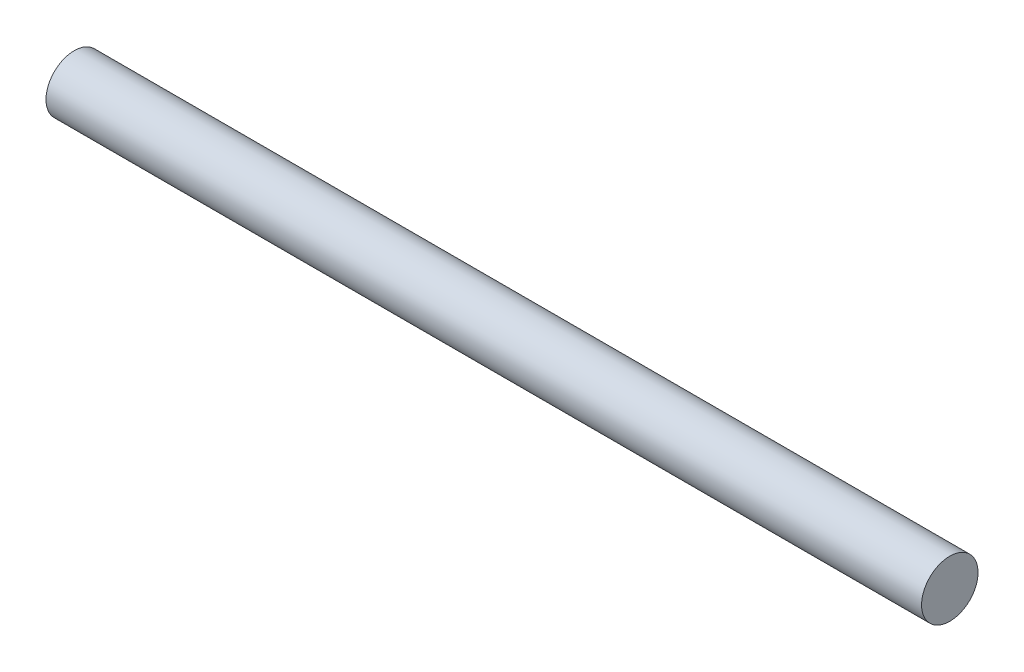
ISO-10303-21;
HEADER;
FILE_DESCRIPTION(('STEP AP214'),'2;1');
FILE_NAME('part.step','',(''),(''),'','','');
FILE_SCHEMA(('AUTOMOTIVE_DESIGN { 1 0 10303 214 1 1 1 1 }'));
ENDSEC;
DATA;
#1=APPLICATION_CONTEXT('core data for automotive mechanical design processes');
#2=APPLICATION_PROTOCOL_DEFINITION('international standard','automotive_design',2000,#1);
#3=PRODUCT_CONTEXT('',#1,'mechanical');
#4=PRODUCT('Part','Part','',(#3));
#5=PRODUCT_RELATED_PRODUCT_CATEGORY('part','',(#4));
#6=PRODUCT_DEFINITION_FORMATION('','',#4);
#7=PRODUCT_DEFINITION_CONTEXT('part definition',#1,'design');
#8=PRODUCT_DEFINITION('design','',#6,#7);
#9=PRODUCT_DEFINITION_SHAPE('','',#8);
#10=(LENGTH_UNIT() NAMED_UNIT(*) SI_UNIT(.MILLI.,.METRE.));
#11=(NAMED_UNIT(*) PLANE_ANGLE_UNIT() SI_UNIT($,.RADIAN.));
#12=(NAMED_UNIT(*) SI_UNIT($,.STERADIAN.) SOLID_ANGLE_UNIT());
#13=UNCERTAINTY_MEASURE_WITH_UNIT(LENGTH_MEASURE(1.E-05),#10,'distance_accuracy_value','');
#14=(GEOMETRIC_REPRESENTATION_CONTEXT(3) GLOBAL_UNCERTAINTY_ASSIGNED_CONTEXT((#13)) GLOBAL_UNIT_ASSIGNED_CONTEXT((#10,
#11,#12)) REPRESENTATION_CONTEXT('',''));
#15=CARTESIAN_POINT('',(0.,0.,0.));
#16=DIRECTION('',(0.,0.,1.));
#17=DIRECTION('',(1.,0.,0.));
#18=AXIS2_PLACEMENT_3D('',#15,#16,#17);
#19=CARTESIAN_POINT('',(62.,-4.01,4.01));
#20=DIRECTION('',(1.,0.,0.));
#21=DIRECTION('',(0.,0.,-1.));
#22=AXIS2_PLACEMENT_3D('',#19,#20,#21);
#23=PLANE('',#22);
#24=CARTESIAN_POINT('',(62.,0.,0.));
#25=DIRECTION('',(-1.,0.,0.));
#26=DIRECTION('',(0.,0.,1.));
#27=AXIS2_PLACEMENT_3D('',#24,#25,#26);
#28=CIRCLE('',#27,4.);
#29=CARTESIAN_POINT('',(62.,0.,4.));
#30=VERTEX_POINT('',#29);
#31=EDGE_CURVE('E19',#30,#30,#28,.T.);
#32=ORIENTED_EDGE('',*,*,#31,.F.);
#33=EDGE_LOOP('',(#32));
#34=FACE_BOUND('',#33,.T.);
#35=ADVANCED_FACE('F15',(#34),#23,.T.);
#36=CARTESIAN_POINT('',(62.,0.,0.));
#37=DIRECTION('',(-1.,0.,0.));
#38=DIRECTION('',(0.,0.,1.));
#39=AXIS2_PLACEMENT_3D('',#36,#37,#38);
#40=CYLINDRICAL_SURFACE('',#39,4.);
#41=CARTESIAN_POINT('',(-62.,0.,0.));
#42=DIRECTION('',(-1.,0.,0.));
#43=DIRECTION('',(0.,0.,1.));
#44=AXIS2_PLACEMENT_3D('',#41,#42,#43);
#45=CIRCLE('',#44,4.);
#46=CARTESIAN_POINT('',(-62.,0.,4.));
#47=VERTEX_POINT('',#46);
#48=EDGE_CURVE('E10',#47,#47,#45,.T.);
#49=ORIENTED_EDGE('',*,*,#48,.F.);
#50=EDGE_LOOP('',(#49));
#51=FACE_BOUND('',#50,.T.);
#52=ORIENTED_EDGE('',*,*,#31,.T.);
#53=EDGE_LOOP('',(#52));
#54=FACE_BOUND('',#53,.T.);
#55=ADVANCED_FACE('F28',(#51,#54),#40,.T.);
#56=CARTESIAN_POINT('',(-62.,-4.01,-4.01));
#57=DIRECTION('',(-1.,0.,0.));
#58=DIRECTION('',(0.,0.,1.));
#59=AXIS2_PLACEMENT_3D('',#56,#57,#58);
#60=PLANE('',#59);
#61=ORIENTED_EDGE('',*,*,#48,.T.);
#62=EDGE_LOOP('',(#61));
#63=FACE_BOUND('',#62,.T.);
#64=ADVANCED_FACE('F17',(#63),#60,.T.);
#65=CLOSED_SHELL('',(#35,#55,#64));
#66=MANIFOLD_SOLID_BREP('B1',#65);
#67=ADVANCED_BREP_SHAPE_REPRESENTATION('',(#18,#66),#14);
#68=SHAPE_DEFINITION_REPRESENTATION(#9,#67);
ENDSEC;
END-ISO-10303-21;
